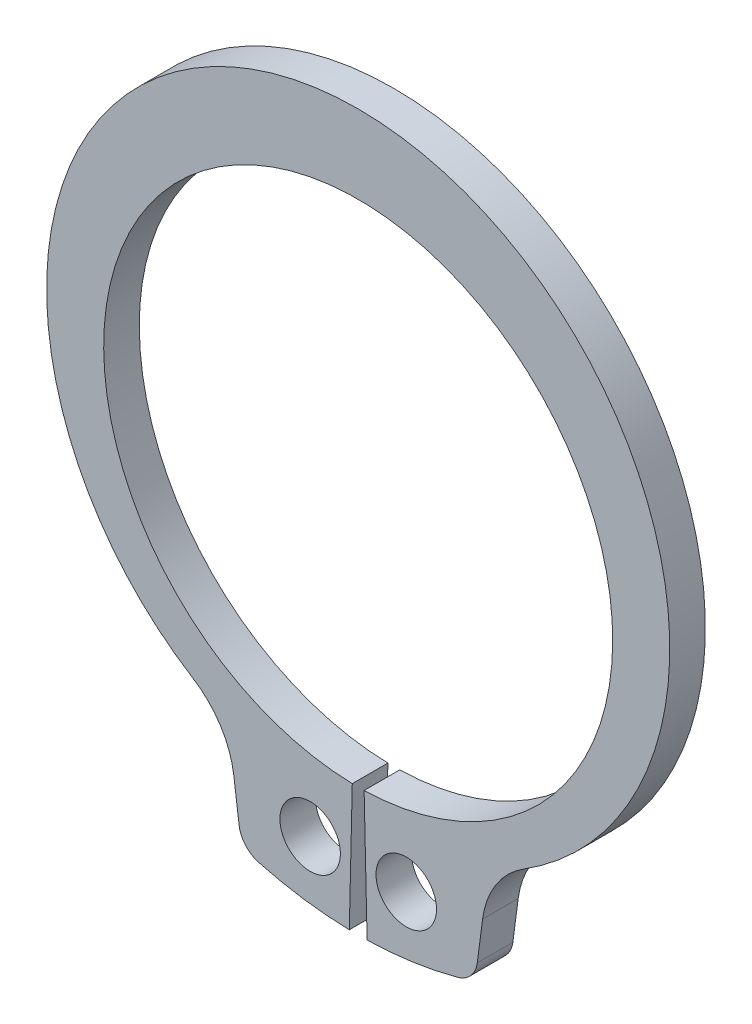
ISO-10303-21;
HEADER;
FILE_DESCRIPTION(('STEP AP214'),'2;1');
FILE_NAME('part.step','',(''),(''),'','','');
FILE_SCHEMA(('AUTOMOTIVE_DESIGN { 1 0 10303 214 1 1 1 1 }'));
ENDSEC;
DATA;
#1=APPLICATION_CONTEXT('core data for automotive mechanical design processes');
#2=APPLICATION_PROTOCOL_DEFINITION('international standard','automotive_design',2000,#1);
#3=PRODUCT_CONTEXT('',#1,'mechanical');
#4=PRODUCT('Part','Part','',(#3));
#5=PRODUCT_RELATED_PRODUCT_CATEGORY('part','',(#4));
#6=PRODUCT_DEFINITION_FORMATION('','',#4);
#7=PRODUCT_DEFINITION_CONTEXT('part definition',#1,'design');
#8=PRODUCT_DEFINITION('design','',#6,#7);
#9=PRODUCT_DEFINITION_SHAPE('','',#8);
#10=(LENGTH_UNIT() NAMED_UNIT(*) SI_UNIT(.MILLI.,.METRE.));
#11=(NAMED_UNIT(*) PLANE_ANGLE_UNIT() SI_UNIT($,.RADIAN.));
#12=(NAMED_UNIT(*) SI_UNIT($,.STERADIAN.) SOLID_ANGLE_UNIT());
#13=UNCERTAINTY_MEASURE_WITH_UNIT(LENGTH_MEASURE(1.E-05),#10,'distance_accuracy_value','');
#14=(GEOMETRIC_REPRESENTATION_CONTEXT(3) GLOBAL_UNCERTAINTY_ASSIGNED_CONTEXT((#13)) GLOBAL_UNIT_ASSIGNED_CONTEXT((#10,
#11,#12)) REPRESENTATION_CONTEXT('',''));
#15=CARTESIAN_POINT('',(0.,0.,0.));
#16=DIRECTION('',(0.,0.,1.));
#17=DIRECTION('',(1.,0.,0.));
#18=AXIS2_PLACEMENT_3D('',#15,#16,#17);
#19=CARTESIAN_POINT('',(0.,0.,-1.));
#20=DIRECTION('',(0.,0.,1.));
#21=DIRECTION('',(1.,0.,0.));
#22=AXIS2_PLACEMENT_3D('',#19,#20,#21);
#23=CYLINDRICAL_SURFACE('',#22,7.15);
#24=CARTESIAN_POINT('',(0.,0.,0.));
#25=DIRECTION('',(0.,0.,-1.));
#26=DIRECTION('',(1.,0.,0.));
#27=AXIS2_PLACEMENT_3D('',#24,#25,#26);
#28=CIRCLE('',#27,7.15);
#29=CARTESIAN_POINT('',(-0.166279069767442,-7.14806626095179,0.));
#30=VERTEX_POINT('',#29);
#31=CARTESIAN_POINT('',(0.166279069767442,-7.14806626095179,0.));
#32=VERTEX_POINT('',#31);
#33=EDGE_CURVE('E153',#30,#32,#28,.T.);
#34=ORIENTED_EDGE('',*,*,#33,.F.);
#35=DIRECTION('',(0.,0.,1.));
#36=VECTOR('',#35,1.);
#37=CARTESIAN_POINT('',(-0.166279069767442,-7.14806626095179,-1.));
#38=LINE('',#37,#36);
#39=CARTESIAN_POINT('',(-0.166279069767442,-7.14806626095179,-1.));
#40=VERTEX_POINT('',#39);
#41=EDGE_CURVE('E11',#40,#30,#38,.T.);
#42=ORIENTED_EDGE('',*,*,#41,.F.);
#43=CARTESIAN_POINT('',(0.,0.,-1.));
#44=DIRECTION('',(0.,0.,-1.));
#45=DIRECTION('',(1.,0.,0.));
#46=AXIS2_PLACEMENT_3D('',#43,#44,#45);
#47=CIRCLE('',#46,7.15);
#48=CARTESIAN_POINT('',(0.166279069767442,-7.14806626095179,-1.));
#49=VERTEX_POINT('',#48);
#50=EDGE_CURVE('E186',#40,#49,#47,.T.);
#51=ORIENTED_EDGE('',*,*,#50,.T.);
#52=DIRECTION('',(0.,0.,1.));
#53=VECTOR('',#52,1.);
#54=CARTESIAN_POINT('',(0.166279069767442,-7.14806626095179,-1.));
#55=LINE('',#54,#53);
#56=EDGE_CURVE('E35',#49,#32,#55,.T.);
#57=ORIENTED_EDGE('',*,*,#56,.T.);
#58=EDGE_LOOP('',(#34,#42,#51,#57));
#59=FACE_BOUND('',#58,.T.);
#60=ADVANCED_FACE('F32',(#59),#23,.F.);
#61=CARTESIAN_POINT('',(-0.166279069767442,-7.14806626095179,-1.));
#62=DIRECTION('',(0.999729546986264,-0.0232558139534884,0.));
#63=DIRECTION('',(0.0232558139534884,0.999729546986264,0.));
#64=AXIS2_PLACEMENT_3D('',#61,#62,#63);
#65=PLANE('',#64);
#66=DIRECTION('',(0.0232558139534884,0.999729546986264,0.));
#67=VECTOR('',#66,1.);
#68=CARTESIAN_POINT('',(-0.166279069767442,-7.14806626095179,0.));
#69=LINE('',#68,#67);
#70=CARTESIAN_POINT('',(-0.25,-10.7470926301023,0.));
#71=VERTEX_POINT('',#70);
#72=EDGE_CURVE('E184',#71,#30,#69,.T.);
#73=ORIENTED_EDGE('',*,*,#72,.F.);
#74=DIRECTION('',(0.,0.,1.));
#75=VECTOR('',#74,1.);
#76=CARTESIAN_POINT('',(-0.25,-10.7470926301023,-1.));
#77=LINE('',#76,#75);
#78=CARTESIAN_POINT('',(-0.25,-10.7470926301023,-1.));
#79=VERTEX_POINT('',#78);
#80=EDGE_CURVE('E41',#79,#71,#77,.T.);
#81=ORIENTED_EDGE('',*,*,#80,.F.);
#82=DIRECTION('',(0.0232558139534884,0.999729546986264,0.));
#83=VECTOR('',#82,1.);
#84=CARTESIAN_POINT('',(-0.166279069767442,-7.14806626095179,-1.));
#85=LINE('',#84,#83);
#86=EDGE_CURVE('E143',#79,#40,#85,.T.);
#87=ORIENTED_EDGE('',*,*,#86,.T.);
#88=ORIENTED_EDGE('',*,*,#41,.T.);
#89=EDGE_LOOP('',(#73,#81,#87,#88));
#90=FACE_BOUND('',#89,.T.);
#91=ADVANCED_FACE('F206',(#90),#65,.T.);
#92=CARTESIAN_POINT('',(0.,0.,-1.));
#93=DIRECTION('',(0.,0.,1.));
#94=DIRECTION('',(1.,0.,0.));
#95=AXIS2_PLACEMENT_3D('',#92,#93,#94);
#96=CYLINDRICAL_SURFACE('',#95,10.75);
#97=CARTESIAN_POINT('',(0.,0.,0.));
#98=DIRECTION('',(0.,0.,1.));
#99=DIRECTION('',(1.,0.,0.));
#100=AXIS2_PLACEMENT_3D('',#97,#98,#99);
#101=CIRCLE('',#100,10.75);
#102=CARTESIAN_POINT('',(-2.79605149977833,-10.3800094417388,0.));
#103=VERTEX_POINT('',#102);
#104=EDGE_CURVE('E130',#103,#71,#101,.T.);
#105=ORIENTED_EDGE('',*,*,#104,.F.);
#106=DIRECTION('',(0.,0.,1.));
#107=VECTOR('',#106,1.);
#108=CARTESIAN_POINT('',(-2.79605149977833,-10.3800094417388,-1.));
#109=LINE('',#108,#107);
#110=CARTESIAN_POINT('',(-2.79605149977833,-10.3800094417388,-1.));
#111=VERTEX_POINT('',#110);
#112=EDGE_CURVE('E125',#111,#103,#109,.T.);
#113=ORIENTED_EDGE('',*,*,#112,.F.);
#114=CARTESIAN_POINT('',(0.,0.,-1.));
#115=DIRECTION('',(0.,0.,1.));
#116=DIRECTION('',(1.,0.,0.));
#117=AXIS2_PLACEMENT_3D('',#114,#115,#116);
#118=CIRCLE('',#117,10.75);
#119=EDGE_CURVE('E128',#111,#79,#118,.T.);
#120=ORIENTED_EDGE('',*,*,#119,.T.);
#121=ORIENTED_EDGE('',*,*,#80,.T.);
#122=EDGE_LOOP('',(#105,#113,#120,#121));
#123=FACE_BOUND('',#122,.T.);
#124=ADVANCED_FACE('F127',(#123),#96,.T.);
#125=CARTESIAN_POINT('',(-2.60097813932867,-9.65582273650124,-1.));
#126=DIRECTION('',(0.,0.,1.));
#127=DIRECTION('',(1.,0.,0.));
#128=AXIS2_PLACEMENT_3D('',#125,#126,#127);
#129=CYLINDRICAL_SURFACE('',#128,0.749999999999999);
#130=CARTESIAN_POINT('',(-2.60097813932867,-9.65582273650124,0.));
#131=DIRECTION('',(0.,0.,1.));
#132=DIRECTION('',(1.,0.,0.));
#133=AXIS2_PLACEMENT_3D('',#130,#131,#132);
#134=CIRCLE('',#133,0.749999999999999);
#135=CARTESIAN_POINT('',(-3.34456178535903,-9.75371738066628,0.));
#136=VERTEX_POINT('',#135);
#137=EDGE_CURVE('E181',#136,#103,#134,.T.);
#138=ORIENTED_EDGE('',*,*,#137,.F.);
#139=DIRECTION('',(0.,0.,1.));
#140=VECTOR('',#139,1.);
#141=CARTESIAN_POINT('',(-3.34456178535903,-9.75371738066628,-1.));
#142=LINE('',#141,#140);
#143=CARTESIAN_POINT('',(-3.34456178535903,-9.75371738066628,-1.));
#144=VERTEX_POINT('',#143);
#145=EDGE_CURVE('E135',#144,#136,#142,.T.);
#146=ORIENTED_EDGE('',*,*,#145,.F.);
#147=CARTESIAN_POINT('',(-2.60097813932867,-9.65582273650124,-1.));
#148=DIRECTION('',(0.,0.,1.));
#149=DIRECTION('',(1.,0.,0.));
#150=AXIS2_PLACEMENT_3D('',#147,#148,#149);
#151=CIRCLE('',#150,0.749999999999999);
#152=EDGE_CURVE('E141',#144,#111,#151,.T.);
#153=ORIENTED_EDGE('',*,*,#152,.T.);
#154=ORIENTED_EDGE('',*,*,#112,.T.);
#155=EDGE_LOOP('',(#138,#146,#153,#154));
#156=FACE_BOUND('',#155,.T.);
#157=ADVANCED_FACE('F145',(#156),#129,.T.);
#158=CARTESIAN_POINT('',(-3.49482072457887,-8.61238742511343,-1.));
#159=DIRECTION('',(-0.99144486137381,-0.130526192220053,0.));
#160=DIRECTION('',(0.130526192220053,-0.99144486137381,0.));
#161=AXIS2_PLACEMENT_3D('',#158,#159,#160);
#162=PLANE('',#161);
#163=DIRECTION('',(0.130526192220053,-0.99144486137381,0.));
#164=VECTOR('',#163,1.);
#165=CARTESIAN_POINT('',(-3.49482072457887,-8.61238742511343,0.));
#166=LINE('',#165,#164);
#167=CARTESIAN_POINT('',(-3.49482072457887,-8.61238742511343,0.));
#168=VERTEX_POINT('',#167);
#169=EDGE_CURVE('E178',#168,#136,#166,.T.);
#170=ORIENTED_EDGE('',*,*,#169,.F.);
#171=DIRECTION('',(0.,0.,1.));
#172=VECTOR('',#171,1.);
#173=CARTESIAN_POINT('',(-3.49482072457887,-8.61238742511343,-1.));
#174=LINE('',#173,#172);
#175=CARTESIAN_POINT('',(-3.49482072457887,-8.61238742511343,-1.));
#176=VERTEX_POINT('',#175);
#177=EDGE_CURVE('E190',#176,#168,#174,.T.);
#178=ORIENTED_EDGE('',*,*,#177,.F.);
#179=DIRECTION('',(0.130526192220053,-0.99144486137381,0.));
#180=VECTOR('',#179,1.);
#181=CARTESIAN_POINT('',(-3.49482072457887,-8.61238742511343,-1.));
#182=LINE('',#181,#180);
#183=EDGE_CURVE('E146',#176,#144,#182,.T.);
#184=ORIENTED_EDGE('',*,*,#183,.T.);
#185=ORIENTED_EDGE('',*,*,#145,.T.);
#186=EDGE_LOOP('',(#170,#178,#184,#185));
#187=FACE_BOUND('',#186,.T.);
#188=ADVANCED_FACE('F219',(#187),#162,.T.);
#189=CARTESIAN_POINT('',(-5.97204747353082,-8.93852051370327,-1.));
#190=DIRECTION('',(0.,0.,1.));
#191=DIRECTION('',(1.,0.,0.));
#192=AXIS2_PLACEMENT_3D('',#189,#190,#191);
#193=CYLINDRICAL_SURFACE('',#192,2.49860264091676);
#194=CARTESIAN_POINT('',(-5.97204747353082,-8.93852051370327,0.));
#195=DIRECTION('',(0.,0.,-1.));
#196=DIRECTION('',(1.,0.,0.));
#197=AXIS2_PLACEMENT_3D('',#194,#195,#196);
#198=CIRCLE('',#197,2.49860264091676);
#199=CARTESIAN_POINT('',(-4.64583650946591,-6.82093234883499,0.));
#200=VERTEX_POINT('',#199);
#201=EDGE_CURVE('E175',#200,#168,#198,.T.);
#202=ORIENTED_EDGE('',*,*,#201,.F.);
#203=DIRECTION('',(0.,0.,1.));
#204=VECTOR('',#203,1.);
#205=CARTESIAN_POINT('',(-4.64583650946591,-6.82093234883499,-1.));
#206=LINE('',#205,#204);
#207=CARTESIAN_POINT('',(-4.64583650946591,-6.82093234883499,-1.));
#208=VERTEX_POINT('',#207);
#209=EDGE_CURVE('E192',#208,#200,#206,.T.);
#210=ORIENTED_EDGE('',*,*,#209,.F.);
#211=CARTESIAN_POINT('',(-5.97204747353082,-8.93852051370327,-1.));
#212=DIRECTION('',(0.,0.,-1.));
#213=DIRECTION('',(1.,0.,0.));
#214=AXIS2_PLACEMENT_3D('',#211,#212,#213);
#215=CIRCLE('',#214,2.49860264091676);
#216=EDGE_CURVE('E148',#208,#176,#215,.T.);
#217=ORIENTED_EDGE('',*,*,#216,.T.);
#218=ORIENTED_EDGE('',*,*,#177,.T.);
#219=EDGE_LOOP('',(#202,#210,#217,#218));
#220=FACE_BOUND('',#219,.T.);
#221=ADVANCED_FACE('F222',(#220),#193,.F.);
#222=CARTESIAN_POINT('',(0.,0.597169804538866,-1.));
#223=DIRECTION('',(0.,0.,1.));
#224=DIRECTION('',(1.,0.,0.));
#225=AXIS2_PLACEMENT_3D('',#222,#223,#224);
#226=CYLINDRICAL_SURFACE('',#225,8.75283019546113);
#227=CARTESIAN_POINT('',(0.,0.597169804538866,0.));
#228=DIRECTION('',(0.,0.,1.));
#229=DIRECTION('',(1.,0.,0.));
#230=AXIS2_PLACEMENT_3D('',#227,#228,#229);
#231=CIRCLE('',#230,8.75283019546113);
#232=CARTESIAN_POINT('',(4.64583650946591,-6.82093234883499,0.));
#233=VERTEX_POINT('',#232);
#234=EDGE_CURVE('E172',#233,#200,#231,.T.);
#235=ORIENTED_EDGE('',*,*,#234,.F.);
#236=DIRECTION('',(0.,0.,1.));
#237=VECTOR('',#236,1.);
#238=CARTESIAN_POINT('',(4.64583650946591,-6.82093234883499,-1.));
#239=LINE('',#238,#237);
#240=CARTESIAN_POINT('',(4.64583650946591,-6.82093234883499,-1.));
#241=VERTEX_POINT('',#240);
#242=EDGE_CURVE('E194',#241,#233,#239,.T.);
#243=ORIENTED_EDGE('',*,*,#242,.F.);
#244=CARTESIAN_POINT('',(0.,0.597169804538866,-1.));
#245=DIRECTION('',(0.,0.,1.));
#246=DIRECTION('',(1.,0.,0.));
#247=AXIS2_PLACEMENT_3D('',#244,#245,#246);
#248=CIRCLE('',#247,8.75283019546113);
#249=EDGE_CURVE('E296',#241,#208,#248,.T.);
#250=ORIENTED_EDGE('',*,*,#249,.T.);
#251=ORIENTED_EDGE('',*,*,#209,.T.);
#252=EDGE_LOOP('',(#235,#243,#250,#251));
#253=FACE_BOUND('',#252,.T.);
#254=ADVANCED_FACE('F226',(#253),#226,.T.);
#255=CARTESIAN_POINT('',(5.97204747353082,-8.93852051370327,-1.));
#256=DIRECTION('',(0.,0.,1.));
#257=DIRECTION('',(1.,0.,0.));
#258=AXIS2_PLACEMENT_3D('',#255,#256,#257);
#259=CYLINDRICAL_SURFACE('',#258,2.49860264091676);
#260=CARTESIAN_POINT('',(5.97204747353082,-8.93852051370327,0.));
#261=DIRECTION('',(0.,0.,-1.));
#262=DIRECTION('',(1.,0.,0.));
#263=AXIS2_PLACEMENT_3D('',#260,#261,#262);
#264=CIRCLE('',#263,2.49860264091676);
#265=CARTESIAN_POINT('',(3.49482072457888,-8.61238742511343,0.));
#266=VERTEX_POINT('',#265);
#267=EDGE_CURVE('E169',#266,#233,#264,.T.);
#268=ORIENTED_EDGE('',*,*,#267,.F.);
#269=DIRECTION('',(0.,0.,1.));
#270=VECTOR('',#269,1.);
#271=CARTESIAN_POINT('',(3.49482072457888,-8.61238742511343,-1.));
#272=LINE('',#271,#270);
#273=CARTESIAN_POINT('',(3.49482072457888,-8.61238742511343,-1.));
#274=VERTEX_POINT('',#273);
#275=EDGE_CURVE('E196',#274,#266,#272,.T.);
#276=ORIENTED_EDGE('',*,*,#275,.F.);
#277=CARTESIAN_POINT('',(5.97204747353082,-8.93852051370327,-1.));
#278=DIRECTION('',(0.,0.,-1.));
#279=DIRECTION('',(1.,0.,0.));
#280=AXIS2_PLACEMENT_3D('',#277,#278,#279);
#281=CIRCLE('',#280,2.49860264091676);
#282=EDGE_CURVE('E293',#274,#241,#281,.T.);
#283=ORIENTED_EDGE('',*,*,#282,.T.);
#284=ORIENTED_EDGE('',*,*,#242,.T.);
#285=EDGE_LOOP('',(#268,#276,#283,#284));
#286=FACE_BOUND('',#285,.T.);
#287=ADVANCED_FACE('F230',(#286),#259,.F.);
#288=CARTESIAN_POINT('',(3.49482072457887,-8.61238742511343,-1.));
#289=DIRECTION('',(0.99144486137381,-0.130526192220053,0.));
#290=DIRECTION('',(0.130526192220053,0.99144486137381,0.));
#291=AXIS2_PLACEMENT_3D('',#288,#289,#290);
#292=PLANE('',#291);
#293=DIRECTION('',(0.130526192220053,0.99144486137381,0.));
#294=VECTOR('',#293,1.);
#295=CARTESIAN_POINT('',(3.49482072457887,-8.61238742511343,0.));
#296=LINE('',#295,#294);
#297=CARTESIAN_POINT('',(3.34456178535903,-9.75371738066628,0.));
#298=VERTEX_POINT('',#297);
#299=EDGE_CURVE('E166',#298,#266,#296,.T.);
#300=ORIENTED_EDGE('',*,*,#299,.F.);
#301=DIRECTION('',(0.,0.,1.));
#302=VECTOR('',#301,1.);
#303=CARTESIAN_POINT('',(3.34456178535903,-9.75371738066628,-1.));
#304=LINE('',#303,#302);
#305=CARTESIAN_POINT('',(3.34456178535903,-9.75371738066628,-1.));
#306=VERTEX_POINT('',#305);
#307=EDGE_CURVE('E198',#306,#298,#304,.T.);
#308=ORIENTED_EDGE('',*,*,#307,.F.);
#309=DIRECTION('',(0.130526192220053,0.99144486137381,0.));
#310=VECTOR('',#309,1.);
#311=CARTESIAN_POINT('',(3.49482072457887,-8.61238742511343,-1.));
#312=LINE('',#311,#310);
#313=EDGE_CURVE('E290',#306,#274,#312,.T.);
#314=ORIENTED_EDGE('',*,*,#313,.T.);
#315=ORIENTED_EDGE('',*,*,#275,.T.);
#316=EDGE_LOOP('',(#300,#308,#314,#315));
#317=FACE_BOUND('',#316,.T.);
#318=ADVANCED_FACE('F234',(#317),#292,.T.);
#319=CARTESIAN_POINT('',(2.60097813932867,-9.65582273650124,-1.));
#320=DIRECTION('',(0.,0.,1.));
#321=DIRECTION('',(1.,0.,0.));
#322=AXIS2_PLACEMENT_3D('',#319,#320,#321);
#323=CYLINDRICAL_SURFACE('',#322,0.749999999999999);
#324=CARTESIAN_POINT('',(2.60097813932867,-9.65582273650124,0.));
#325=DIRECTION('',(0.,0.,1.));
#326=DIRECTION('',(-1.,0.,0.));
#327=AXIS2_PLACEMENT_3D('',#324,#325,#326);
#328=CIRCLE('',#327,0.749999999999999);
#329=CARTESIAN_POINT('',(2.79605149977832,-10.3800094417388,0.));
#330=VERTEX_POINT('',#329);
#331=EDGE_CURVE('E163',#330,#298,#328,.T.);
#332=ORIENTED_EDGE('',*,*,#331,.F.);
#333=DIRECTION('',(0.,0.,1.));
#334=VECTOR('',#333,1.);
#335=CARTESIAN_POINT('',(2.79605149977832,-10.3800094417388,-1.));
#336=LINE('',#335,#334);
#337=CARTESIAN_POINT('',(2.79605149977832,-10.3800094417388,-1.));
#338=VERTEX_POINT('',#337);
#339=EDGE_CURVE('E200',#338,#330,#336,.T.);
#340=ORIENTED_EDGE('',*,*,#339,.F.);
#341=CARTESIAN_POINT('',(2.60097813932867,-9.65582273650124,-1.));
#342=DIRECTION('',(0.,0.,1.));
#343=DIRECTION('',(-1.,0.,0.));
#344=AXIS2_PLACEMENT_3D('',#341,#342,#343);
#345=CIRCLE('',#344,0.749999999999999);
#346=EDGE_CURVE('E287',#338,#306,#345,.T.);
#347=ORIENTED_EDGE('',*,*,#346,.T.);
#348=ORIENTED_EDGE('',*,*,#307,.T.);
#349=EDGE_LOOP('',(#332,#340,#347,#348));
#350=FACE_BOUND('',#349,.T.);
#351=ADVANCED_FACE('F238',(#350),#323,.T.);
#352=CARTESIAN_POINT('',(0.,0.,-1.));
#353=DIRECTION('',(0.,0.,1.));
#354=DIRECTION('',(1.,0.,0.));
#355=AXIS2_PLACEMENT_3D('',#352,#353,#354);
#356=CYLINDRICAL_SURFACE('',#355,10.75);
#357=CARTESIAN_POINT('',(0.,0.,0.));
#358=DIRECTION('',(0.,0.,1.));
#359=DIRECTION('',(1.,0.,0.));
#360=AXIS2_PLACEMENT_3D('',#357,#358,#359);
#361=CIRCLE('',#360,10.75);
#362=CARTESIAN_POINT('',(0.249999999999996,-10.7470926301023,0.));
#363=VERTEX_POINT('',#362);
#364=EDGE_CURVE('E160',#363,#330,#361,.T.);
#365=ORIENTED_EDGE('',*,*,#364,.F.);
#366=DIRECTION('',(0.,0.,1.));
#367=VECTOR('',#366,1.);
#368=CARTESIAN_POINT('',(0.249999999999996,-10.7470926301023,-1.));
#369=LINE('',#368,#367);
#370=CARTESIAN_POINT('',(0.249999999999996,-10.7470926301023,-1.));
#371=VERTEX_POINT('',#370);
#372=EDGE_CURVE('E201',#371,#363,#369,.T.);
#373=ORIENTED_EDGE('',*,*,#372,.F.);
#374=CARTESIAN_POINT('',(0.,0.,-1.));
#375=DIRECTION('',(0.,0.,1.));
#376=DIRECTION('',(1.,0.,0.));
#377=AXIS2_PLACEMENT_3D('',#374,#375,#376);
#378=CIRCLE('',#377,10.75);
#379=EDGE_CURVE('E284',#371,#338,#378,.T.);
#380=ORIENTED_EDGE('',*,*,#379,.T.);
#381=ORIENTED_EDGE('',*,*,#339,.T.);
#382=EDGE_LOOP('',(#365,#373,#380,#381));
#383=FACE_BOUND('',#382,.T.);
#384=ADVANCED_FACE('F242',(#383),#356,.T.);
#385=CARTESIAN_POINT('',(0.166279069767442,-7.14806626095179,-1.));
#386=DIRECTION('',(-0.999729546986264,-0.0232558139534884,0.));
#387=DIRECTION('',(0.0232558139534884,-0.999729546986264,0.));
#388=AXIS2_PLACEMENT_3D('',#385,#386,#387);
#389=PLANE('',#388);
#390=DIRECTION('',(0.0232558139534884,-0.999729546986264,0.));
#391=VECTOR('',#390,1.);
#392=CARTESIAN_POINT('',(0.166279069767442,-7.14806626095179,0.));
#393=LINE('',#392,#391);
#394=EDGE_CURVE('E156',#32,#363,#393,.T.);
#395=ORIENTED_EDGE('',*,*,#394,.F.);
#396=ORIENTED_EDGE('',*,*,#56,.F.);
#397=DIRECTION('',(0.0232558139534884,-0.999729546986264,0.));
#398=VECTOR('',#397,1.);
#399=CARTESIAN_POINT('',(0.166279069767442,-7.14806626095179,-1.));
#400=LINE('',#399,#398);
#401=EDGE_CURVE('E282',#49,#371,#400,.T.);
#402=ORIENTED_EDGE('',*,*,#401,.T.);
#403=ORIENTED_EDGE('',*,*,#372,.T.);
#404=EDGE_LOOP('',(#395,#396,#402,#403));
#405=FACE_BOUND('',#404,.T.);
#406=ADVANCED_FACE('F203',(#405),#389,.T.);
#407=CARTESIAN_POINT('',(0.,0.,-1.));
#408=DIRECTION('',(0.,0.,1.));
#409=DIRECTION('',(1.,0.,0.));
#410=AXIS2_PLACEMENT_3D('',#407,#408,#409);
#411=PLANE('',#410);
#412=CARTESIAN_POINT('',(-1.35,-9.02458447796905,-1.));
#413=DIRECTION('',(0.,0.,1.));
#414=DIRECTION('',(1.,0.,0.));
#415=AXIS2_PLACEMENT_3D('',#412,#413,#414);
#416=CIRCLE('',#415,0.85);
#417=CARTESIAN_POINT('',(-0.5,-9.02458447796905,-1.));
#418=VERTEX_POINT('',#417);
#419=EDGE_CURVE('E269',#418,#418,#416,.T.);
#420=ORIENTED_EDGE('',*,*,#419,.T.);
#421=EDGE_LOOP('',(#420));
#422=FACE_BOUND('',#421,.T.);
#423=CARTESIAN_POINT('',(1.35,-9.02458447796905,-1.));
#424=DIRECTION('',(0.,0.,1.));
#425=DIRECTION('',(1.,0.,0.));
#426=AXIS2_PLACEMENT_3D('',#423,#424,#425);
#427=CIRCLE('',#426,0.85);
#428=CARTESIAN_POINT('',(2.2,-9.02458447796905,-1.));
#429=VERTEX_POINT('',#428);
#430=EDGE_CURVE('E157',#429,#429,#427,.T.);
#431=ORIENTED_EDGE('',*,*,#430,.T.);
#432=EDGE_LOOP('',(#431));
#433=FACE_BOUND('',#432,.T.);
#434=ORIENTED_EDGE('',*,*,#50,.F.);
#435=ORIENTED_EDGE('',*,*,#86,.F.);
#436=ORIENTED_EDGE('',*,*,#119,.F.);
#437=ORIENTED_EDGE('',*,*,#152,.F.);
#438=ORIENTED_EDGE('',*,*,#183,.F.);
#439=ORIENTED_EDGE('',*,*,#216,.F.);
#440=ORIENTED_EDGE('',*,*,#249,.F.);
#441=ORIENTED_EDGE('',*,*,#282,.F.);
#442=ORIENTED_EDGE('',*,*,#313,.F.);
#443=ORIENTED_EDGE('',*,*,#346,.F.);
#444=ORIENTED_EDGE('',*,*,#379,.F.);
#445=ORIENTED_EDGE('',*,*,#401,.F.);
#446=EDGE_LOOP('',(#434,#435,#436,#437,#438,#439,#440,#441,#442,#443,#444,#445));
#447=FACE_BOUND('',#446,.T.);
#448=ADVANCED_FACE('F139',(#422,#433,#447),#411,.F.);
#449=CARTESIAN_POINT('',(0.,0.,0.));
#450=DIRECTION('',(0.,0.,1.));
#451=DIRECTION('',(1.,0.,0.));
#452=AXIS2_PLACEMENT_3D('',#449,#450,#451);
#453=PLANE('',#452);
#454=CARTESIAN_POINT('',(-1.35,-9.02458447796905,0.));
#455=DIRECTION('',(0.,0.,1.));
#456=DIRECTION('',(1.,0.,0.));
#457=AXIS2_PLACEMENT_3D('',#454,#455,#456);
#458=CIRCLE('',#457,0.85);
#459=CARTESIAN_POINT('',(-0.5,-9.02458447796905,0.));
#460=VERTEX_POINT('',#459);
#461=EDGE_CURVE('E272',#460,#460,#458,.T.);
#462=ORIENTED_EDGE('',*,*,#461,.F.);
#463=EDGE_LOOP('',(#462));
#464=FACE_BOUND('',#463,.T.);
#465=CARTESIAN_POINT('',(1.35,-9.02458447796905,0.));
#466=DIRECTION('',(0.,0.,1.));
#467=DIRECTION('',(1.,0.,0.));
#468=AXIS2_PLACEMENT_3D('',#465,#466,#467);
#469=CIRCLE('',#468,0.85);
#470=CARTESIAN_POINT('',(2.2,-9.02458447796905,0.));
#471=VERTEX_POINT('',#470);
#472=EDGE_CURVE('E274',#471,#471,#469,.T.);
#473=ORIENTED_EDGE('',*,*,#472,.F.);
#474=EDGE_LOOP('',(#473));
#475=FACE_BOUND('',#474,.T.);
#476=ORIENTED_EDGE('',*,*,#33,.T.);
#477=ORIENTED_EDGE('',*,*,#394,.T.);
#478=ORIENTED_EDGE('',*,*,#364,.T.);
#479=ORIENTED_EDGE('',*,*,#331,.T.);
#480=ORIENTED_EDGE('',*,*,#299,.T.);
#481=ORIENTED_EDGE('',*,*,#267,.T.);
#482=ORIENTED_EDGE('',*,*,#234,.T.);
#483=ORIENTED_EDGE('',*,*,#201,.T.);
#484=ORIENTED_EDGE('',*,*,#169,.T.);
#485=ORIENTED_EDGE('',*,*,#137,.T.);
#486=ORIENTED_EDGE('',*,*,#104,.T.);
#487=ORIENTED_EDGE('',*,*,#72,.T.);
#488=EDGE_LOOP('',(#476,#477,#478,#479,#480,#481,#482,#483,#484,#485,#486,#487));
#489=FACE_BOUND('',#488,.T.);
#490=ADVANCED_FACE('F205',(#464,#475,#489),#453,.T.);
#491=CARTESIAN_POINT('',(1.35,-9.02458447796905,-1.));
#492=DIRECTION('',(0.,0.,1.));
#493=DIRECTION('',(1.,0.,0.));
#494=AXIS2_PLACEMENT_3D('',#491,#492,#493);
#495=CYLINDRICAL_SURFACE('',#494,0.85);
#496=ORIENTED_EDGE('',*,*,#430,.F.);
#497=EDGE_LOOP('',(#496));
#498=FACE_BOUND('',#497,.T.);
#499=ORIENTED_EDGE('',*,*,#472,.T.);
#500=EDGE_LOOP('',(#499));
#501=FACE_BOUND('',#500,.T.);
#502=ADVANCED_FACE('F254',(#498,#501),#495,.F.);
#503=CARTESIAN_POINT('',(-1.35,-9.02458447796905,-1.));
#504=DIRECTION('',(0.,0.,1.));
#505=DIRECTION('',(1.,0.,0.));
#506=AXIS2_PLACEMENT_3D('',#503,#504,#505);
#507=CYLINDRICAL_SURFACE('',#506,0.85);
#508=ORIENTED_EDGE('',*,*,#419,.F.);
#509=EDGE_LOOP('',(#508));
#510=FACE_BOUND('',#509,.T.);
#511=ORIENTED_EDGE('',*,*,#461,.T.);
#512=EDGE_LOOP('',(#511));
#513=FACE_BOUND('',#512,.T.);
#514=ADVANCED_FACE('F261',(#510,#513),#507,.F.);
#515=CLOSED_SHELL('',(#60,#91,#124,#157,#188,#221,#254,#287,#318,#351,#384,#406,#448,#490,#502,#514));
#516=MANIFOLD_SOLID_BREP('B2',#515);
#517=ADVANCED_BREP_SHAPE_REPRESENTATION('',(#18,#516),#14);
#518=SHAPE_DEFINITION_REPRESENTATION(#9,#517);
ENDSEC;
END-ISO-10303-21;
